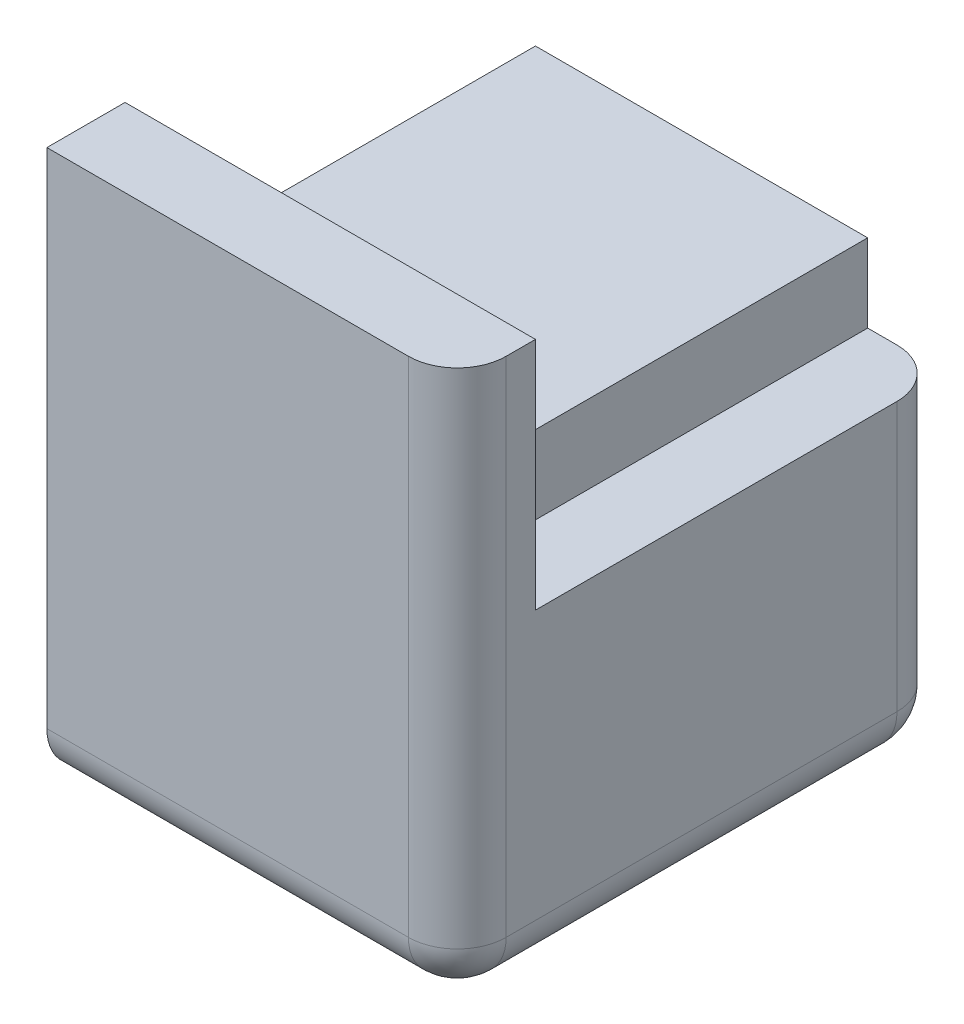
ISO-10303-21;
HEADER;
FILE_DESCRIPTION(('STEP AP214'),'2;1');
FILE_NAME('part.step','',(''),(''),'','','');
FILE_SCHEMA(('AUTOMOTIVE_DESIGN { 1 0 10303 214 1 1 1 1 }'));
ENDSEC;
DATA;
#1=APPLICATION_CONTEXT('core data for automotive mechanical design processes');
#2=APPLICATION_PROTOCOL_DEFINITION('international standard','automotive_design',2000,#1);
#3=PRODUCT_CONTEXT('',#1,'mechanical');
#4=PRODUCT('Part','Part','',(#3));
#5=PRODUCT_RELATED_PRODUCT_CATEGORY('part','',(#4));
#6=PRODUCT_DEFINITION_FORMATION('','',#4);
#7=PRODUCT_DEFINITION_CONTEXT('part definition',#1,'design');
#8=PRODUCT_DEFINITION('design','',#6,#7);
#9=PRODUCT_DEFINITION_SHAPE('','',#8);
#10=(LENGTH_UNIT() NAMED_UNIT(*) SI_UNIT(.MILLI.,.METRE.));
#11=(NAMED_UNIT(*) PLANE_ANGLE_UNIT() SI_UNIT($,.RADIAN.));
#12=(NAMED_UNIT(*) SI_UNIT($,.STERADIAN.) SOLID_ANGLE_UNIT());
#13=UNCERTAINTY_MEASURE_WITH_UNIT(LENGTH_MEASURE(1.E-05),#10,'distance_accuracy_value','');
#14=(GEOMETRIC_REPRESENTATION_CONTEXT(3) GLOBAL_UNCERTAINTY_ASSIGNED_CONTEXT((#13)) GLOBAL_UNIT_ASSIGNED_CONTEXT((#10,
#11,#12)) REPRESENTATION_CONTEXT('',''));
#15=CARTESIAN_POINT('',(0.,0.,0.));
#16=DIRECTION('',(0.,0.,1.));
#17=DIRECTION('',(1.,0.,0.));
#18=AXIS2_PLACEMENT_3D('',#15,#16,#17);
#19=CARTESIAN_POINT('',(-7.1,11.3,3.4));
#20=DIRECTION('',(0.,0.,1.));
#21=DIRECTION('',(0.,-1.,0.));
#22=AXIS2_PLACEMENT_3D('',#19,#20,#21);
#23=PLANE('',#22);
#24=DIRECTION('',(0.,1.,0.));
#25=VECTOR('',#24,1.);
#26=CARTESIAN_POINT('',(2.6,9.8,3.4));
#27=LINE('',#26,#25);
#28=CARTESIAN_POINT('',(2.6,6.5,3.4));
#29=VERTEX_POINT('',#28);
#30=CARTESIAN_POINT('',(2.6,9.70000000000001,3.4));
#31=VERTEX_POINT('',#30);
#32=EDGE_CURVE('E187',#29,#31,#27,.T.);
#33=ORIENTED_EDGE('',*,*,#32,.T.);
#34=DIRECTION('',(1.,0.,0.));
#35=VECTOR('',#34,1.);
#36=CARTESIAN_POINT('',(2.6,9.70000000000001,3.4));
#37=LINE('',#36,#35);
#38=CARTESIAN_POINT('',(-4.20000000000001,9.70000000000001,3.4));
#39=VERTEX_POINT('',#38);
#40=EDGE_CURVE('E161',#39,#31,#37,.T.);
#41=ORIENTED_EDGE('',*,*,#40,.F.);
#42=DIRECTION('',(0.,-1.,0.));
#43=VECTOR('',#42,1.);
#44=CARTESIAN_POINT('',(-4.20000000000001,11.3,3.4));
#45=LINE('',#44,#43);
#46=CARTESIAN_POINT('',(-4.20000000000001,11.3,3.4));
#47=VERTEX_POINT('',#46);
#48=EDGE_CURVE('E200',#47,#39,#45,.T.);
#49=ORIENTED_EDGE('',*,*,#48,.F.);
#50=DIRECTION('',(-1.,0.,0.));
#51=VECTOR('',#50,1.);
#52=CARTESIAN_POINT('',(0.,11.3,3.4));
#53=LINE('',#52,#51);
#54=CARTESIAN_POINT('',(4.2,11.3,3.4));
#55=VERTEX_POINT('',#54);
#56=EDGE_CURVE('E219',#55,#47,#53,.T.);
#57=ORIENTED_EDGE('',*,*,#56,.F.);
#58=DIRECTION('',(0.,-1.,0.));
#59=VECTOR('',#58,1.);
#60=CARTESIAN_POINT('',(4.2,11.3,3.4));
#61=LINE('',#60,#59);
#62=CARTESIAN_POINT('',(4.2,6.5,3.4));
#63=VERTEX_POINT('',#62);
#64=EDGE_CURVE('E197',#55,#63,#61,.T.);
#65=ORIENTED_EDGE('',*,*,#64,.T.);
#66=DIRECTION('',(-1.,0.,0.));
#67=VECTOR('',#66,1.);
#68=CARTESIAN_POINT('',(4.2,6.5,3.4));
#69=LINE('',#68,#67);
#70=EDGE_CURVE('E184',#63,#29,#69,.T.);
#71=ORIENTED_EDGE('',*,*,#70,.T.);
#72=EDGE_LOOP('',(#33,#41,#49,#57,#65,#71));
#73=FACE_BOUND('',#72,.T.);
#74=ADVANCED_FACE('F37',(#73),#23,.F.);
#75=CARTESIAN_POINT('',(-4.2,8.1,3.4));
#76=DIRECTION('',(0.,-1.,0.));
#77=DIRECTION('',(1.,0.,0.));
#78=AXIS2_PLACEMENT_3D('',#75,#76,#77);
#79=PLANE('',#78);
#80=DIRECTION('',(-1.,0.,0.));
#81=VECTOR('',#80,1.);
#82=CARTESIAN_POINT('',(2.6,8.10000000000001,1.8));
#83=LINE('',#82,#81);
#84=CARTESIAN_POINT('',(2.6,8.1,1.8));
#85=VERTEX_POINT('',#84);
#86=CARTESIAN_POINT('',(-4.2,8.10000000000001,1.8));
#87=VERTEX_POINT('',#86);
#88=EDGE_CURVE('E160',#85,#87,#83,.T.);
#89=ORIENTED_EDGE('',*,*,#88,.F.);
#90=DIRECTION('',(0.,0.,-1.));
#91=VECTOR('',#90,1.);
#92=CARTESIAN_POINT('',(2.6,8.1,3.4));
#93=LINE('',#92,#91);
#94=CARTESIAN_POINT('',(2.6,8.1,-5.));
#95=VERTEX_POINT('',#94);
#96=EDGE_CURVE('E176',#85,#95,#93,.T.);
#97=ORIENTED_EDGE('',*,*,#96,.T.);
#98=DIRECTION('',(1.,0.,0.));
#99=VECTOR('',#98,1.);
#100=CARTESIAN_POINT('',(-4.2,8.1,-5.));
#101=LINE('',#100,#99);
#102=CARTESIAN_POINT('',(-4.2,8.1,-5.));
#103=VERTEX_POINT('',#102);
#104=EDGE_CURVE('E179',#103,#95,#101,.T.);
#105=ORIENTED_EDGE('',*,*,#104,.F.);
#106=DIRECTION('',(0.,0.,-1.));
#107=VECTOR('',#106,1.);
#108=CARTESIAN_POINT('',(-4.2,8.1,3.4));
#109=LINE('',#108,#107);
#110=EDGE_CURVE('E177',#87,#103,#109,.T.);
#111=ORIENTED_EDGE('',*,*,#110,.F.);
#112=EDGE_LOOP('',(#89,#97,#105,#111));
#113=FACE_BOUND('',#112,.T.);
#114=ADVANCED_FACE('F287',(#113),#79,.F.);
#115=CARTESIAN_POINT('',(4.2,11.3,5.));
#116=DIRECTION('',(-1.,0.,0.));
#117=DIRECTION('',(0.,0.,1.));
#118=AXIS2_PLACEMENT_3D('',#115,#116,#117);
#119=PLANE('',#118);
#120=DIRECTION('',(0.,0.,-1.));
#121=VECTOR('',#120,1.);
#122=CARTESIAN_POINT('',(4.2,11.3,5.));
#123=LINE('',#122,#121);
#124=CARTESIAN_POINT('',(4.2,11.3,4.));
#125=VERTEX_POINT('',#124);
#126=EDGE_CURVE('E204',#125,#55,#123,.T.);
#127=ORIENTED_EDGE('',*,*,#126,.F.);
#128=DIRECTION('',(0.,-1.,0.));
#129=VECTOR('',#128,1.);
#130=CARTESIAN_POINT('',(4.2,11.3,4.));
#131=LINE('',#130,#129);
#132=CARTESIAN_POINT('',(4.2,1.,4.));
#133=VERTEX_POINT('',#132);
#134=EDGE_CURVE('E241',#125,#133,#131,.T.);
#135=ORIENTED_EDGE('',*,*,#134,.T.);
#136=DIRECTION('',(0.,0.,-1.));
#137=VECTOR('',#136,1.);
#138=CARTESIAN_POINT('',(4.2,1.,-5.));
#139=LINE('',#138,#137);
#140=CARTESIAN_POINT('',(4.2,1.,-4.));
#141=VERTEX_POINT('',#140);
#142=EDGE_CURVE('E237',#133,#141,#139,.T.);
#143=ORIENTED_EDGE('',*,*,#142,.T.);
#144=DIRECTION('',(0.,-1.,0.));
#145=VECTOR('',#144,1.);
#146=CARTESIAN_POINT('',(4.2,11.3,-4.));
#147=LINE('',#146,#145);
#148=CARTESIAN_POINT('',(4.2,6.5,-4.));
#149=VERTEX_POINT('',#148);
#150=EDGE_CURVE('E239',#141,#149,#147,.F.);
#151=ORIENTED_EDGE('',*,*,#150,.T.);
#152=DIRECTION('',(0.,0.,-1.));
#153=VECTOR('',#152,1.);
#154=CARTESIAN_POINT('',(4.2,6.5,3.4));
#155=LINE('',#154,#153);
#156=EDGE_CURVE('E190',#63,#149,#155,.T.);
#157=ORIENTED_EDGE('',*,*,#156,.F.);
#158=ORIENTED_EDGE('',*,*,#64,.F.);
#159=EDGE_LOOP('',(#127,#135,#143,#151,#157,#158));
#160=FACE_BOUND('',#159,.T.);
#161=ADVANCED_FACE('F299',(#160),#119,.F.);
#162=CARTESIAN_POINT('',(-4.20000000000001,11.3,-5.));
#163=DIRECTION('',(0.,0.,1.));
#164=DIRECTION('',(1.,0.,0.));
#165=AXIS2_PLACEMENT_3D('',#162,#163,#164);
#166=PLANE('',#165);
#167=DIRECTION('',(-1.,0.,0.));
#168=VECTOR('',#167,1.);
#169=CARTESIAN_POINT('',(4.2,6.5,-5.));
#170=LINE('',#169,#168);
#171=CARTESIAN_POINT('',(3.2,6.5,-5.));
#172=VERTEX_POINT('',#171);
#173=CARTESIAN_POINT('',(2.6,6.5,-5.));
#174=VERTEX_POINT('',#173);
#175=EDGE_CURVE('E183',#172,#174,#170,.T.);
#176=ORIENTED_EDGE('',*,*,#175,.F.);
#177=DIRECTION('',(0.,-1.,0.));
#178=VECTOR('',#177,1.);
#179=CARTESIAN_POINT('',(3.2,11.3,-5.));
#180=LINE('',#179,#178);
#181=CARTESIAN_POINT('',(3.2,1.,-5.));
#182=VERTEX_POINT('',#181);
#183=EDGE_CURVE('E46',#172,#182,#180,.T.);
#184=ORIENTED_EDGE('',*,*,#183,.T.);
#185=DIRECTION('',(-1.,0.,0.));
#186=VECTOR('',#185,1.);
#187=CARTESIAN_POINT('',(-4.20000000000001,1.,-5.));
#188=LINE('',#187,#186);
#189=CARTESIAN_POINT('',(-4.20000000000001,1.,-5.));
#190=VERTEX_POINT('',#189);
#191=EDGE_CURVE('E245',#182,#190,#188,.T.);
#192=ORIENTED_EDGE('',*,*,#191,.T.);
#193=DIRECTION('',(0.,-1.,0.));
#194=VECTOR('',#193,1.);
#195=CARTESIAN_POINT('',(-4.20000000000001,11.3,-5.));
#196=LINE('',#195,#194);
#197=EDGE_CURVE('E216',#103,#190,#196,.T.);
#198=ORIENTED_EDGE('',*,*,#197,.F.);
#199=ORIENTED_EDGE('',*,*,#104,.T.);
#200=DIRECTION('',(0.,1.,0.));
#201=VECTOR('',#200,1.);
#202=CARTESIAN_POINT('',(2.6,9.8,-5.));
#203=LINE('',#202,#201);
#204=EDGE_CURVE('E188',#174,#95,#203,.T.);
#205=ORIENTED_EDGE('',*,*,#204,.F.);
#206=EDGE_LOOP('',(#176,#184,#192,#198,#199,#205));
#207=FACE_BOUND('',#206,.T.);
#208=ADVANCED_FACE('F280',(#207),#166,.F.);
#209=CARTESIAN_POINT('',(-4.20000000000001,11.3,5.));
#210=DIRECTION('',(1.,0.,0.));
#211=DIRECTION('',(0.,0.,-1.));
#212=AXIS2_PLACEMENT_3D('',#209,#210,#211);
#213=PLANE('',#212);
#214=CARTESIAN_POINT('',(-4.20000000000001,5.,0.));
#215=DIRECTION('',(-1.,0.,0.));
#216=DIRECTION('',(0.,0.,1.));
#217=AXIS2_PLACEMENT_3D('',#214,#215,#216);
#218=CIRCLE('',#217,1.24999999999999);
#219=CARTESIAN_POINT('',(-4.20000000000001,5.,1.24999999999999));
#220=VERTEX_POINT('',#219);
#221=EDGE_CURVE('E150',#220,#220,#218,.T.);
#222=ORIENTED_EDGE('',*,*,#221,.F.);
#223=EDGE_LOOP('',(#222));
#224=FACE_BOUND('',#223,.T.);
#225=DIRECTION('',(0.,0.,1.));
#226=VECTOR('',#225,1.);
#227=CARTESIAN_POINT('',(-4.20000000000001,0.,5.));
#228=LINE('',#227,#226);
#229=CARTESIAN_POINT('',(-4.20000000000001,0.,-4.));
#230=VERTEX_POINT('',#229);
#231=CARTESIAN_POINT('',(-4.20000000000001,0.,4.));
#232=VERTEX_POINT('',#231);
#233=EDGE_CURVE('E203',#230,#232,#228,.T.);
#234=ORIENTED_EDGE('',*,*,#233,.T.);
#235=CARTESIAN_POINT('',(-4.20000000000001,1.,4.));
#236=DIRECTION('',(1.,0.,0.));
#237=DIRECTION('',(0.,0.,-1.));
#238=AXIS2_PLACEMENT_3D('',#235,#236,#237);
#239=CIRCLE('',#238,1.);
#240=CARTESIAN_POINT('',(-4.20000000000001,1.,5.));
#241=VERTEX_POINT('',#240);
#242=EDGE_CURVE('E235',#232,#241,#239,.F.);
#243=ORIENTED_EDGE('',*,*,#242,.T.);
#244=DIRECTION('',(0.,-1.,0.));
#245=VECTOR('',#244,1.);
#246=CARTESIAN_POINT('',(-4.20000000000001,11.3,5.));
#247=LINE('',#246,#245);
#248=CARTESIAN_POINT('',(-4.20000000000001,11.3,5.));
#249=VERTEX_POINT('',#248);
#250=EDGE_CURVE('E211',#249,#241,#247,.T.);
#251=ORIENTED_EDGE('',*,*,#250,.F.);
#252=DIRECTION('',(0.,0.,1.));
#253=VECTOR('',#252,1.);
#254=CARTESIAN_POINT('',(-4.20000000000001,11.3,5.));
#255=LINE('',#254,#253);
#256=EDGE_CURVE('E206',#47,#249,#255,.T.);
#257=ORIENTED_EDGE('',*,*,#256,.F.);
#258=ORIENTED_EDGE('',*,*,#48,.T.);
#259=DIRECTION('',(0.,0.,1.));
#260=VECTOR('',#259,1.);
#261=CARTESIAN_POINT('',(-4.20000000000001,9.70000000000001,1.8));
#262=LINE('',#261,#260);
#263=CARTESIAN_POINT('',(-4.20000000000001,9.70000000000001,1.8));
#264=VERTEX_POINT('',#263);
#265=EDGE_CURVE('E173',#264,#39,#262,.T.);
#266=ORIENTED_EDGE('',*,*,#265,.F.);
#267=DIRECTION('',(0.,1.,0.));
#268=VECTOR('',#267,1.);
#269=CARTESIAN_POINT('',(-4.2,8.10000000000001,1.8));
#270=LINE('',#269,#268);
#271=EDGE_CURVE('E164',#87,#264,#270,.T.);
#272=ORIENTED_EDGE('',*,*,#271,.F.);
#273=ORIENTED_EDGE('',*,*,#110,.T.);
#274=ORIENTED_EDGE('',*,*,#197,.T.);
#275=CARTESIAN_POINT('',(-4.20000000000001,1.,-4.));
#276=DIRECTION('',(1.,0.,0.));
#277=DIRECTION('',(0.,0.,-1.));
#278=AXIS2_PLACEMENT_3D('',#275,#276,#277);
#279=CIRCLE('',#278,1.);
#280=EDGE_CURVE('E233',#190,#230,#279,.F.);
#281=ORIENTED_EDGE('',*,*,#280,.T.);
#282=EDGE_LOOP('',(#234,#243,#251,#257,#258,#266,#272,#273,#274,#281));
#283=FACE_BOUND('',#282,.T.);
#284=ADVANCED_FACE('F282',(#224,#283),#213,.F.);
#285=CARTESIAN_POINT('',(-4.20000000000001,11.3,5.));
#286=DIRECTION('',(0.,0.,-1.));
#287=DIRECTION('',(-1.,0.,0.));
#288=AXIS2_PLACEMENT_3D('',#285,#286,#287);
#289=PLANE('',#288);
#290=ORIENTED_EDGE('',*,*,#250,.T.);
#291=DIRECTION('',(1.,0.,0.));
#292=VECTOR('',#291,1.);
#293=CARTESIAN_POINT('',(4.2,1.,5.));
#294=LINE('',#293,#292);
#295=CARTESIAN_POINT('',(3.2,1.,5.));
#296=VERTEX_POINT('',#295);
#297=EDGE_CURVE('E224',#241,#296,#294,.T.);
#298=ORIENTED_EDGE('',*,*,#297,.T.);
#299=DIRECTION('',(0.,-1.,0.));
#300=VECTOR('',#299,1.);
#301=CARTESIAN_POINT('',(3.2,11.3,5.));
#302=LINE('',#301,#300);
#303=CARTESIAN_POINT('',(3.2,11.3,5.));
#304=VERTEX_POINT('',#303);
#305=EDGE_CURVE('E222',#296,#304,#302,.F.);
#306=ORIENTED_EDGE('',*,*,#305,.T.);
#307=DIRECTION('',(1.,0.,0.));
#308=VECTOR('',#307,1.);
#309=CARTESIAN_POINT('',(-4.20000000000001,11.3,5.));
#310=LINE('',#309,#308);
#311=EDGE_CURVE('E208',#249,#304,#310,.T.);
#312=ORIENTED_EDGE('',*,*,#311,.F.);
#313=EDGE_LOOP('',(#290,#298,#306,#312));
#314=FACE_BOUND('',#313,.T.);
#315=ADVANCED_FACE('F316',(#314),#289,.F.);
#316=CARTESIAN_POINT('',(0.,11.3,0.));
#317=DIRECTION('',(0.,-1.,0.));
#318=DIRECTION('',(0.,0.,-1.));
#319=AXIS2_PLACEMENT_3D('',#316,#317,#318);
#320=PLANE('',#319);
#321=ORIENTED_EDGE('',*,*,#311,.T.);
#322=CARTESIAN_POINT('',(3.2,11.3,4.));
#323=DIRECTION('',(0.,-1.,0.));
#324=DIRECTION('',(0.,0.,-1.));
#325=AXIS2_PLACEMENT_3D('',#322,#323,#324);
#326=CIRCLE('',#325,1.);
#327=EDGE_CURVE('E243',#304,#125,#326,.F.);
#328=ORIENTED_EDGE('',*,*,#327,.T.);
#329=ORIENTED_EDGE('',*,*,#126,.T.);
#330=ORIENTED_EDGE('',*,*,#56,.T.);
#331=ORIENTED_EDGE('',*,*,#256,.T.);
#332=EDGE_LOOP('',(#321,#328,#329,#330,#331));
#333=FACE_BOUND('',#332,.T.);
#334=ADVANCED_FACE('F318',(#333),#320,.F.);
#335=CARTESIAN_POINT('',(0.,0.,0.));
#336=DIRECTION('',(0.,-1.,0.));
#337=DIRECTION('',(0.,0.,-1.));
#338=AXIS2_PLACEMENT_3D('',#335,#336,#337);
#339=PLANE('',#338);
#340=DIRECTION('',(0.,0.,-1.));
#341=VECTOR('',#340,1.);
#342=CARTESIAN_POINT('',(3.2,0.,5.));
#343=LINE('',#342,#341);
#344=CARTESIAN_POINT('',(3.2,0.,-4.));
#345=VERTEX_POINT('',#344);
#346=CARTESIAN_POINT('',(3.2,0.,4.));
#347=VERTEX_POINT('',#346);
#348=EDGE_CURVE('E227',#345,#347,#343,.F.);
#349=ORIENTED_EDGE('',*,*,#348,.T.);
#350=DIRECTION('',(1.,0.,0.));
#351=VECTOR('',#350,1.);
#352=CARTESIAN_POINT('',(-4.20000000000001,0.,4.));
#353=LINE('',#352,#351);
#354=EDGE_CURVE('E231',#347,#232,#353,.F.);
#355=ORIENTED_EDGE('',*,*,#354,.T.);
#356=ORIENTED_EDGE('',*,*,#233,.F.);
#357=DIRECTION('',(-1.,0.,0.));
#358=VECTOR('',#357,1.);
#359=CARTESIAN_POINT('',(4.2,0.,-4.));
#360=LINE('',#359,#358);
#361=EDGE_CURVE('E229',#230,#345,#360,.F.);
#362=ORIENTED_EDGE('',*,*,#361,.T.);
#363=EDGE_LOOP('',(#349,#355,#356,#362));
#364=FACE_BOUND('',#363,.T.);
#365=ADVANCED_FACE('F273',(#364),#339,.T.);
#366=CARTESIAN_POINT('',(2.6,9.8,3.4));
#367=DIRECTION('',(-1.,0.,0.));
#368=DIRECTION('',(0.,-1.,0.));
#369=AXIS2_PLACEMENT_3D('',#366,#367,#368);
#370=PLANE('',#369);
#371=ORIENTED_EDGE('',*,*,#204,.T.);
#372=ORIENTED_EDGE('',*,*,#96,.F.);
#373=DIRECTION('',(0.,-1.,0.));
#374=VECTOR('',#373,1.);
#375=CARTESIAN_POINT('',(2.6,8.10000000000001,1.8));
#376=LINE('',#375,#374);
#377=CARTESIAN_POINT('',(2.6,9.70000000000001,1.8));
#378=VERTEX_POINT('',#377);
#379=EDGE_CURVE('E157',#378,#85,#376,.T.);
#380=ORIENTED_EDGE('',*,*,#379,.F.);
#381=DIRECTION('',(0.,0.,1.));
#382=VECTOR('',#381,1.);
#383=CARTESIAN_POINT('',(2.6,9.70000000000001,1.8));
#384=LINE('',#383,#382);
#385=EDGE_CURVE('E168',#378,#31,#384,.T.);
#386=ORIENTED_EDGE('',*,*,#385,.T.);
#387=ORIENTED_EDGE('',*,*,#32,.F.);
#388=DIRECTION('',(0.,0.,-1.));
#389=VECTOR('',#388,1.);
#390=CARTESIAN_POINT('',(2.6,6.5,3.4));
#391=LINE('',#390,#389);
#392=EDGE_CURVE('E194',#29,#174,#391,.T.);
#393=ORIENTED_EDGE('',*,*,#392,.T.);
#394=EDGE_LOOP('',(#371,#372,#380,#386,#387,#393));
#395=FACE_BOUND('',#394,.T.);
#396=ADVANCED_FACE('F291',(#395),#370,.F.);
#397=CARTESIAN_POINT('',(4.2,6.5,3.4));
#398=DIRECTION('',(0.,-1.,0.));
#399=DIRECTION('',(0.,0.,-1.));
#400=AXIS2_PLACEMENT_3D('',#397,#398,#399);
#401=PLANE('',#400);
#402=ORIENTED_EDGE('',*,*,#156,.T.);
#403=CARTESIAN_POINT('',(3.2,6.5,-4.));
#404=DIRECTION('',(0.,-1.,0.));
#405=DIRECTION('',(0.,0.,-1.));
#406=AXIS2_PLACEMENT_3D('',#403,#404,#405);
#407=CIRCLE('',#406,1.);
#408=EDGE_CURVE('E11',#149,#172,#407,.F.);
#409=ORIENTED_EDGE('',*,*,#408,.T.);
#410=ORIENTED_EDGE('',*,*,#175,.T.);
#411=ORIENTED_EDGE('',*,*,#392,.F.);
#412=ORIENTED_EDGE('',*,*,#70,.F.);
#413=EDGE_LOOP('',(#402,#409,#410,#411,#412));
#414=FACE_BOUND('',#413,.T.);
#415=ADVANCED_FACE('F295',(#414),#401,.F.);
#416=CARTESIAN_POINT('',(2.6,9.70000000000001,1.8));
#417=DIRECTION('',(0.,-1.,0.));
#418=DIRECTION('',(0.,0.,-1.));
#419=AXIS2_PLACEMENT_3D('',#416,#417,#418);
#420=PLANE('',#419);
#421=ORIENTED_EDGE('',*,*,#40,.T.);
#422=ORIENTED_EDGE('',*,*,#385,.F.);
#423=DIRECTION('',(1.,0.,0.));
#424=VECTOR('',#423,1.);
#425=CARTESIAN_POINT('',(2.6,9.70000000000001,1.8));
#426=LINE('',#425,#424);
#427=EDGE_CURVE('E166',#264,#378,#426,.T.);
#428=ORIENTED_EDGE('',*,*,#427,.F.);
#429=ORIENTED_EDGE('',*,*,#265,.T.);
#430=EDGE_LOOP('',(#421,#422,#428,#429));
#431=FACE_BOUND('',#430,.T.);
#432=ADVANCED_FACE('F323',(#431),#420,.F.);
#433=CARTESIAN_POINT('',(0.,0.,1.80000000000001));
#434=DIRECTION('',(0.,0.,1.));
#435=DIRECTION('',(0.,-1.,0.));
#436=AXIS2_PLACEMENT_3D('',#433,#434,#435);
#437=PLANE('',#436);
#438=ORIENTED_EDGE('',*,*,#379,.T.);
#439=ORIENTED_EDGE('',*,*,#88,.T.);
#440=ORIENTED_EDGE('',*,*,#271,.T.);
#441=ORIENTED_EDGE('',*,*,#427,.T.);
#442=EDGE_LOOP('',(#438,#439,#440,#441));
#443=FACE_BOUND('',#442,.T.);
#444=ADVANCED_FACE('F326',(#443),#437,.F.);
#445=CARTESIAN_POINT('',(3.2,11.3,-4.));
#446=DIRECTION('',(0.,-1.,0.));
#447=DIRECTION('',(0.,0.,-1.));
#448=AXIS2_PLACEMENT_3D('',#445,#446,#447);
#449=CYLINDRICAL_SURFACE('',#448,1.);
#450=ORIENTED_EDGE('',*,*,#408,.F.);
#451=ORIENTED_EDGE('',*,*,#150,.F.);
#452=CARTESIAN_POINT('',(3.2,1.,-4.));
#453=DIRECTION('',(0.,-1.,0.));
#454=DIRECTION('',(0.,0.,-1.));
#455=AXIS2_PLACEMENT_3D('',#452,#453,#454);
#456=CIRCLE('',#455,1.);
#457=EDGE_CURVE('E41',#182,#141,#456,.T.);
#458=ORIENTED_EDGE('',*,*,#457,.F.);
#459=ORIENTED_EDGE('',*,*,#183,.F.);
#460=EDGE_LOOP('',(#450,#451,#458,#459));
#461=FACE_BOUND('',#460,.T.);
#462=ADVANCED_FACE('F39',(#461),#449,.T.);
#463=CARTESIAN_POINT('',(-4.20000000000001,1.,-4.));
#464=DIRECTION('',(1.,0.,0.));
#465=DIRECTION('',(0.,0.,-1.));
#466=AXIS2_PLACEMENT_3D('',#463,#464,#465);
#467=CYLINDRICAL_SURFACE('',#466,1.);
#468=ORIENTED_EDGE('',*,*,#280,.F.);
#469=ORIENTED_EDGE('',*,*,#191,.F.);
#470=CARTESIAN_POINT('',(3.2,1.,-4.));
#471=DIRECTION('',(1.,0.,0.));
#472=DIRECTION('',(0.,0.,-1.));
#473=AXIS2_PLACEMENT_3D('',#470,#471,#472);
#474=CIRCLE('',#473,1.);
#475=EDGE_CURVE('E255',#345,#182,#474,.T.);
#476=ORIENTED_EDGE('',*,*,#475,.F.);
#477=ORIENTED_EDGE('',*,*,#361,.F.);
#478=EDGE_LOOP('',(#468,#469,#476,#477));
#479=FACE_BOUND('',#478,.T.);
#480=ADVANCED_FACE('F278',(#479),#467,.T.);
#481=CARTESIAN_POINT('',(3.2,1.,-4.));
#482=DIRECTION('',(0.,0.,1.));
#483=DIRECTION('',(1.,0.,0.));
#484=AXIS2_PLACEMENT_3D('',#481,#482,#483);
#485=SPHERICAL_SURFACE('',#484,1.);
#486=ORIENTED_EDGE('',*,*,#475,.T.);
#487=ORIENTED_EDGE('',*,*,#457,.T.);
#488=CARTESIAN_POINT('',(3.2,1.,-4.));
#489=DIRECTION('',(0.,0.,-1.));
#490=DIRECTION('',(-1.,0.,0.));
#491=AXIS2_PLACEMENT_3D('',#488,#489,#490);
#492=CIRCLE('',#491,1.);
#493=EDGE_CURVE('E253',#345,#141,#492,.F.);
#494=ORIENTED_EDGE('',*,*,#493,.F.);
#495=EDGE_LOOP('',(#486,#487,#494));
#496=FACE_BOUND('',#495,.T.);
#497=ADVANCED_FACE('F262',(#496),#485,.T.);
#498=CARTESIAN_POINT('',(3.2,11.3,4.));
#499=DIRECTION('',(0.,-1.,0.));
#500=DIRECTION('',(0.,0.,-1.));
#501=AXIS2_PLACEMENT_3D('',#498,#499,#500);
#502=CYLINDRICAL_SURFACE('',#501,1.);
#503=ORIENTED_EDGE('',*,*,#327,.F.);
#504=ORIENTED_EDGE('',*,*,#305,.F.);
#505=CARTESIAN_POINT('',(3.2,1.,4.));
#506=DIRECTION('',(0.,-1.,0.));
#507=DIRECTION('',(0.,0.,-1.));
#508=AXIS2_PLACEMENT_3D('',#505,#506,#507);
#509=CIRCLE('',#508,1.);
#510=EDGE_CURVE('E250',#133,#296,#509,.T.);
#511=ORIENTED_EDGE('',*,*,#510,.F.);
#512=ORIENTED_EDGE('',*,*,#134,.F.);
#513=EDGE_LOOP('',(#503,#504,#511,#512));
#514=FACE_BOUND('',#513,.T.);
#515=ADVANCED_FACE('F304',(#514),#502,.T.);
#516=CARTESIAN_POINT('',(3.2,1.,5.));
#517=DIRECTION('',(0.,0.,1.));
#518=DIRECTION('',(1.,0.,0.));
#519=AXIS2_PLACEMENT_3D('',#516,#517,#518);
#520=CYLINDRICAL_SURFACE('',#519,1.);
#521=ORIENTED_EDGE('',*,*,#493,.T.);
#522=ORIENTED_EDGE('',*,*,#142,.F.);
#523=CARTESIAN_POINT('',(3.2,1.,4.));
#524=DIRECTION('',(0.,0.,1.));
#525=DIRECTION('',(1.,0.,0.));
#526=AXIS2_PLACEMENT_3D('',#523,#524,#525);
#527=CIRCLE('',#526,1.);
#528=EDGE_CURVE('E152',#347,#133,#527,.T.);
#529=ORIENTED_EDGE('',*,*,#528,.F.);
#530=ORIENTED_EDGE('',*,*,#348,.F.);
#531=EDGE_LOOP('',(#521,#522,#529,#530));
#532=FACE_BOUND('',#531,.T.);
#533=ADVANCED_FACE('F268',(#532),#520,.T.);
#534=CARTESIAN_POINT('',(3.2,1.,4.));
#535=DIRECTION('',(0.,0.,1.));
#536=DIRECTION('',(1.,0.,0.));
#537=AXIS2_PLACEMENT_3D('',#534,#535,#536);
#538=SPHERICAL_SURFACE('',#537,1.);
#539=ORIENTED_EDGE('',*,*,#528,.T.);
#540=ORIENTED_EDGE('',*,*,#510,.T.);
#541=CARTESIAN_POINT('',(3.2,1.,4.));
#542=DIRECTION('',(1.,0.,0.));
#543=DIRECTION('',(0.,0.,-1.));
#544=AXIS2_PLACEMENT_3D('',#541,#542,#543);
#545=CIRCLE('',#544,1.);
#546=EDGE_CURVE('E149',#347,#296,#545,.F.);
#547=ORIENTED_EDGE('',*,*,#546,.F.);
#548=EDGE_LOOP('',(#539,#540,#547));
#549=FACE_BOUND('',#548,.T.);
#550=ADVANCED_FACE('F308',(#549),#538,.T.);
#551=CARTESIAN_POINT('',(-4.20000000000001,1.,4.));
#552=DIRECTION('',(-1.,0.,0.));
#553=DIRECTION('',(0.,0.,1.));
#554=AXIS2_PLACEMENT_3D('',#551,#552,#553);
#555=CYLINDRICAL_SURFACE('',#554,1.);
#556=ORIENTED_EDGE('',*,*,#242,.F.);
#557=ORIENTED_EDGE('',*,*,#354,.F.);
#558=ORIENTED_EDGE('',*,*,#546,.T.);
#559=ORIENTED_EDGE('',*,*,#297,.F.);
#560=EDGE_LOOP('',(#556,#557,#558,#559));
#561=FACE_BOUND('',#560,.T.);
#562=ADVANCED_FACE('F143',(#561),#555,.T.);
#563=CARTESIAN_POINT('',(2.29999999999999,5.,0.));
#564=DIRECTION('',(-1.,0.,0.));
#565=DIRECTION('',(0.,0.,1.));
#566=AXIS2_PLACEMENT_3D('',#563,#564,#565);
#567=CONICAL_SURFACE('',#566,1.25,1.02974425867665);
#568=CARTESIAN_POINT('',(3.05107577378445,5.,0.));
#569=VERTEX_POINT('',#568);
#570=VERTEX_LOOP('',#569);
#571=FACE_BOUND('',#570,.T.);
#572=CARTESIAN_POINT('',(2.29999999999999,5.,0.));
#573=DIRECTION('',(-1.,0.,0.));
#574=DIRECTION('',(0.,0.,1.));
#575=AXIS2_PLACEMENT_3D('',#572,#573,#574);
#576=CIRCLE('',#575,1.25);
#577=CARTESIAN_POINT('',(2.29999999999999,5.,1.25));
#578=VERTEX_POINT('',#577);
#579=EDGE_CURVE('E147',#578,#578,#576,.T.);
#580=ORIENTED_EDGE('',*,*,#579,.T.);
#581=EDGE_LOOP('',(#580));
#582=FACE_BOUND('',#581,.T.);
#583=ADVANCED_FACE('F139',(#571,#582),#567,.F.);
#584=CARTESIAN_POINT('',(-4.20000000000001,5.,0.));
#585=DIRECTION('',(-1.,0.,0.));
#586=DIRECTION('',(0.,0.,1.));
#587=AXIS2_PLACEMENT_3D('',#584,#585,#586);
#588=CYLINDRICAL_SURFACE('',#587,1.24999999999999);
#589=ORIENTED_EDGE('',*,*,#579,.F.);
#590=EDGE_LOOP('',(#589));
#591=FACE_BOUND('',#590,.T.);
#592=ORIENTED_EDGE('',*,*,#221,.T.);
#593=EDGE_LOOP('',(#592));
#594=FACE_BOUND('',#593,.T.);
#595=ADVANCED_FACE('F142',(#591,#594),#588,.F.);
#596=CLOSED_SHELL('',(#74,#114,#161,#208,#284,#315,#334,#365,#396,#415,#432,#444,#462,#480,#497,
#515,#533,#550,#562,#583,#595));
#597=MANIFOLD_SOLID_BREP('B2',#596);
#598=ADVANCED_BREP_SHAPE_REPRESENTATION('',(#18,#597),#14);
#599=SHAPE_DEFINITION_REPRESENTATION(#9,#598);
ENDSEC;
END-ISO-10303-21;
